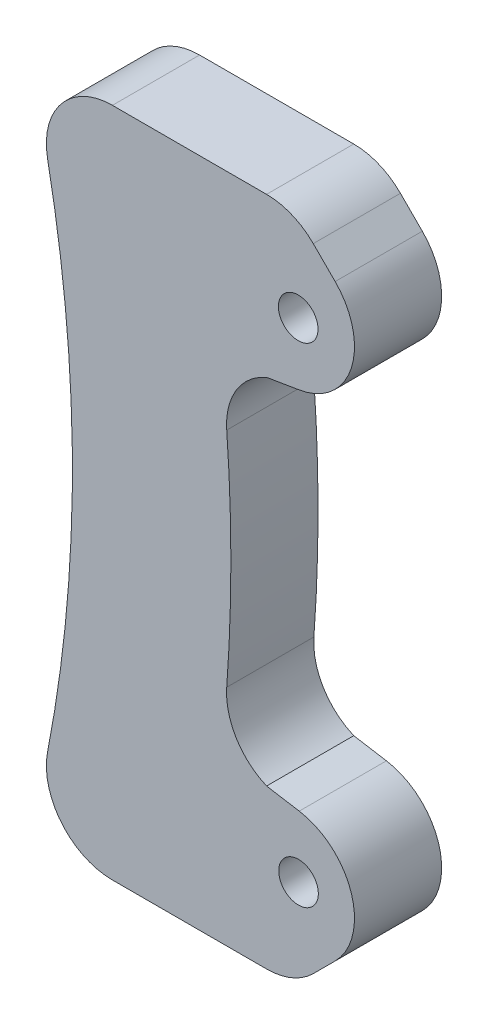
ISO-10303-21;
HEADER;
FILE_DESCRIPTION(('STEP AP214'),'2;1');
FILE_NAME('part.step','',(''),(''),'','','');
FILE_SCHEMA(('AUTOMOTIVE_DESIGN { 1 0 10303 214 1 1 1 1 }'));
ENDSEC;
DATA;
#1=APPLICATION_CONTEXT('core data for automotive mechanical design processes');
#2=APPLICATION_PROTOCOL_DEFINITION('international standard','automotive_design',2000,#1);
#3=PRODUCT_CONTEXT('',#1,'mechanical');
#4=PRODUCT('Part','Part','',(#3));
#5=PRODUCT_RELATED_PRODUCT_CATEGORY('part','',(#4));
#6=PRODUCT_DEFINITION_FORMATION('','',#4);
#7=PRODUCT_DEFINITION_CONTEXT('part definition',#1,'design');
#8=PRODUCT_DEFINITION('design','',#6,#7);
#9=PRODUCT_DEFINITION_SHAPE('','',#8);
#10=(LENGTH_UNIT() NAMED_UNIT(*) SI_UNIT(.MILLI.,.METRE.));
#11=(NAMED_UNIT(*) PLANE_ANGLE_UNIT() SI_UNIT($,.RADIAN.));
#12=(NAMED_UNIT(*) SI_UNIT($,.STERADIAN.) SOLID_ANGLE_UNIT());
#13=UNCERTAINTY_MEASURE_WITH_UNIT(LENGTH_MEASURE(1.E-05),#10,'distance_accuracy_value','');
#14=(GEOMETRIC_REPRESENTATION_CONTEXT(3) GLOBAL_UNCERTAINTY_ASSIGNED_CONTEXT((#13)) GLOBAL_UNIT_ASSIGNED_CONTEXT((#10,
#11,#12)) REPRESENTATION_CONTEXT('',''));
#15=CARTESIAN_POINT('',(0.,0.,0.));
#16=DIRECTION('',(0.,0.,1.));
#17=DIRECTION('',(1.,0.,0.));
#18=AXIS2_PLACEMENT_3D('',#15,#16,#17);
#19=CARTESIAN_POINT('',(-0.101035194584402,8.80446178487082,6.6));
#20=DIRECTION('',(0.,0.,1.));
#21=DIRECTION('',(1.,0.,0.));
#22=AXIS2_PLACEMENT_3D('',#19,#20,#21);
#23=PLANE('',#22);
#24=CARTESIAN_POINT('',(0.3250331716,18.5,6.6));
#25=DIRECTION('',(0.,0.,1.));
#26=DIRECTION('',(1.,0.,0.));
#27=AXIS2_PLACEMENT_3D('',#24,#25,#26);
#28=CIRCLE('',#27,1.5);
#29=CARTESIAN_POINT('',(1.8250331716,18.5,6.6));
#30=VERTEX_POINT('',#29);
#31=EDGE_CURVE('E182',#30,#30,#28,.T.);
#32=ORIENTED_EDGE('',*,*,#31,.F.);
#33=EDGE_LOOP('',(#32));
#34=FACE_BOUND('',#33,.T.);
#35=CARTESIAN_POINT('',(-0.101035194584402,8.80446178487082,6.6));
#36=DIRECTION('',(0.,0.,-1.));
#37=DIRECTION('',(1.,0.,0.));
#38=AXIS2_PLACEMENT_3D('',#35,#36,#37);
#39=CIRCLE('',#38,5.);
#40=CARTESIAN_POINT('',(-5.08723847448388,8.43327874172404,6.6));
#41=VERTEX_POINT('',#40);
#42=CARTESIAN_POINT('',(-2.0710678119,13.4,6.6));
#43=VERTEX_POINT('',#42);
#44=EDGE_CURVE('E209',#41,#43,#39,.T.);
#45=ORIENTED_EDGE('',*,*,#44,.T.);
#46=DIRECTION('',(0.986550454329536,0.163457031241201,0.));
#47=VECTOR('',#46,1.);
#48=CARTESIAN_POINT('',(-2.0710678119,13.4,6.6));
#49=LINE('',#48,#47);
#50=CARTESIAN_POINT('',(0.4034701921,13.8099948807,6.6));
#51=VERTEX_POINT('',#50);
#52=EDGE_CURVE('E117',#43,#51,#49,.T.);
#53=ORIENTED_EDGE('',*,*,#52,.T.);
#54=CARTESIAN_POINT('',(-0.413814964197921,18.7427471523324,6.6));
#55=DIRECTION('',(0.,0.,1.));
#56=DIRECTION('',(1.,0.,0.));
#57=AXIS2_PLACEMENT_3D('',#54,#55,#56);
#58=CIRCLE('',#57,5.);
#59=CARTESIAN_POINT('',(3.1217189417,22.2782810583,6.6));
#60=VERTEX_POINT('',#59);
#61=EDGE_CURVE('E248',#51,#60,#58,.T.);
#62=ORIENTED_EDGE('',*,*,#61,.T.);
#63=DIRECTION('',(-0.707106781186547,0.707106781186548,0.));
#64=VECTOR('',#63,1.);
#65=CARTESIAN_POINT('',(3.1217189417,22.2782810583,6.6));
#66=LINE('',#65,#64);
#67=CARTESIAN_POINT('',(1.4644660941,23.9355339059,6.6));
#68=VERTEX_POINT('',#67);
#69=EDGE_CURVE('E267',#60,#68,#66,.T.);
#70=ORIENTED_EDGE('',*,*,#69,.T.);
#71=CARTESIAN_POINT('',(-2.07106781186548,20.4,6.6));
#72=DIRECTION('',(0.,0.,1.));
#73=DIRECTION('',(1.,0.,0.));
#74=AXIS2_PLACEMENT_3D('',#71,#72,#73);
#75=CIRCLE('',#74,5.00000000000001);
#76=CARTESIAN_POINT('',(-2.0710678119,25.4,6.6));
#77=VERTEX_POINT('',#76);
#78=EDGE_CURVE('E264',#68,#77,#75,.T.);
#79=ORIENTED_EDGE('',*,*,#78,.T.);
#80=DIRECTION('',(-1.,0.,0.));
#81=VECTOR('',#80,1.);
#82=CARTESIAN_POINT('',(-2.0710678119,25.4,6.6));
#83=LINE('',#82,#81);
#84=CARTESIAN_POINT('',(-13.7439533295,25.4,6.6));
#85=VERTEX_POINT('',#84);
#86=EDGE_CURVE('E266',#77,#85,#83,.T.);
#87=ORIENTED_EDGE('',*,*,#86,.T.);
#88=CARTESIAN_POINT('',(-13.7439533295,20.4,6.6));
#89=DIRECTION('',(0.,0.,1.));
#90=DIRECTION('',(1.,0.,0.));
#91=AXIS2_PLACEMENT_3D('',#88,#89,#90);
#92=CIRCLE('',#91,5.);
#93=CARTESIAN_POINT('',(-18.6515435576519,19.4431519699825,6.6));
#94=VERTEX_POINT('',#93);
#95=EDGE_CURVE('E269',#85,#94,#92,.T.);
#96=ORIENTED_EDGE('',*,*,#95,.T.);
#97=CARTESIAN_POINT('',(-118.373776993707,9.16791800709747E-11,6.6));
#98=DIRECTION('',(0.,0.,-1.));
#99=DIRECTION('',(1.,0.,0.));
#100=AXIS2_PLACEMENT_3D('',#97,#98,#99);
#101=CIRCLE('',#100,101.600000000012);
#102=CARTESIAN_POINT('',(-18.651543557666,-19.4431519699523,6.6));
#103=VERTEX_POINT('',#102);
#104=EDGE_CURVE('E275',#94,#103,#101,.T.);
#105=ORIENTED_EDGE('',*,*,#104,.T.);
#106=CARTESIAN_POINT('',(-13.7439533295044,-20.4,6.6));
#107=DIRECTION('',(0.,0.,1.));
#108=DIRECTION('',(1.,0.,0.));
#109=AXIS2_PLACEMENT_3D('',#106,#107,#108);
#110=CIRCLE('',#109,5.);
#111=CARTESIAN_POINT('',(-13.7439533295,-25.4,6.6));
#112=VERTEX_POINT('',#111);
#113=EDGE_CURVE('E277',#103,#112,#110,.T.);
#114=ORIENTED_EDGE('',*,*,#113,.T.);
#115=DIRECTION('',(1.,0.,0.));
#116=VECTOR('',#115,1.);
#117=CARTESIAN_POINT('',(-13.7439533295,-25.4,6.6));
#118=LINE('',#117,#116);
#119=CARTESIAN_POINT('',(-2.0710678119,-25.4,6.6));
#120=VERTEX_POINT('',#119);
#121=EDGE_CURVE('E279',#112,#120,#118,.T.);
#122=ORIENTED_EDGE('',*,*,#121,.T.);
#123=CARTESIAN_POINT('',(-2.07106781186546,-20.4,6.6));
#124=DIRECTION('',(0.,0.,1.));
#125=DIRECTION('',(1.,0.,0.));
#126=AXIS2_PLACEMENT_3D('',#123,#124,#125);
#127=CIRCLE('',#126,4.99999999999997);
#128=CARTESIAN_POINT('',(1.4644660941,-23.9355339059,6.6));
#129=VERTEX_POINT('',#128);
#130=EDGE_CURVE('E281',#120,#129,#127,.T.);
#131=ORIENTED_EDGE('',*,*,#130,.T.);
#132=DIRECTION('',(0.707106781186547,0.707106781186548,0.));
#133=VECTOR('',#132,1.);
#134=CARTESIAN_POINT('',(1.4644660941,-23.9355339059,6.6));
#135=LINE('',#134,#133);
#136=CARTESIAN_POINT('',(3.1217189417,-22.2782810583,6.6));
#137=VERTEX_POINT('',#136);
#138=EDGE_CURVE('E283',#129,#137,#135,.T.);
#139=ORIENTED_EDGE('',*,*,#138,.T.);
#140=CARTESIAN_POINT('',(-0.413814964197924,-18.7427471523324,6.6));
#141=DIRECTION('',(0.,0.,1.));
#142=DIRECTION('',(1.,0.,0.));
#143=AXIS2_PLACEMENT_3D('',#140,#141,#142);
#144=CIRCLE('',#143,5.);
#145=CARTESIAN_POINT('',(0.403470192100001,-13.8099948807,6.6));
#146=VERTEX_POINT('',#145);
#147=EDGE_CURVE('E160',#137,#146,#144,.T.);
#148=ORIENTED_EDGE('',*,*,#147,.T.);
#149=DIRECTION('',(-0.986550454329536,0.163457031241201,0.));
#150=VECTOR('',#149,1.);
#151=CARTESIAN_POINT('',(0.4034701921,-13.8099948807,6.6));
#152=LINE('',#151,#150);
#153=CARTESIAN_POINT('',(-2.0710678119,-13.4,6.6));
#154=VERTEX_POINT('',#153);
#155=EDGE_CURVE('E154',#146,#154,#152,.T.);
#156=ORIENTED_EDGE('',*,*,#155,.T.);
#157=CARTESIAN_POINT('',(-0.101035194597395,-8.80446178486501,6.6));
#158=DIRECTION('',(0.,0.,-1.));
#159=DIRECTION('',(1.,0.,0.));
#160=AXIS2_PLACEMENT_3D('',#157,#158,#159);
#161=CIRCLE('',#160,5.00000000000022);
#162=CARTESIAN_POINT('',(-5.08723847449502,-8.43327874169032,6.6));
#163=VERTEX_POINT('',#162);
#164=EDGE_CURVE('E158',#154,#163,#161,.T.);
#165=ORIENTED_EDGE('',*,*,#164,.T.);
#166=CARTESIAN_POINT('',(-118.373776993707,9.16791800709747E-11,6.6));
#167=DIRECTION('',(0.,0.,1.));
#168=DIRECTION('',(1.,0.,0.));
#169=AXIS2_PLACEMENT_3D('',#166,#167,#168);
#170=CIRCLE('',#169,113.600000000006);
#171=EDGE_CURVE('E50',#163,#41,#170,.T.);
#172=ORIENTED_EDGE('',*,*,#171,.T.);
#173=EDGE_LOOP('',(#45,#53,#62,#70,#79,#87,#96,#105,#114,#122,#131,#139,#148,#156,#165,#172));
#174=FACE_BOUND('',#173,.T.);
#175=CARTESIAN_POINT('',(0.3484564424,-18.5,6.6));
#176=DIRECTION('',(0.,0.,1.));
#177=DIRECTION('',(1.,0.,0.));
#178=AXIS2_PLACEMENT_3D('',#175,#176,#177);
#179=CIRCLE('',#178,1.50000000000001);
#180=CARTESIAN_POINT('',(1.84845644240001,-18.5,6.6));
#181=VERTEX_POINT('',#180);
#182=EDGE_CURVE('E326',#181,#181,#179,.T.);
#183=ORIENTED_EDGE('',*,*,#182,.F.);
#184=EDGE_LOOP('',(#183));
#185=FACE_BOUND('',#184,.T.);
#186=ADVANCED_FACE('F33',(#34,#174,#185),#23,.T.);
#187=CARTESIAN_POINT('',(-0.101035194584402,8.80446178487082,0.));
#188=DIRECTION('',(0.,0.,1.));
#189=DIRECTION('',(1.,0.,0.));
#190=AXIS2_PLACEMENT_3D('',#187,#188,#189);
#191=PLANE('',#190);
#192=CARTESIAN_POINT('',(0.3250331716,18.5,0.));
#193=DIRECTION('',(0.,0.,1.));
#194=DIRECTION('',(1.,0.,0.));
#195=AXIS2_PLACEMENT_3D('',#192,#193,#194);
#196=CIRCLE('',#195,1.5);
#197=CARTESIAN_POINT('',(1.8250331716,18.5,0.));
#198=VERTEX_POINT('',#197);
#199=EDGE_CURVE('E331',#198,#198,#196,.T.);
#200=ORIENTED_EDGE('',*,*,#199,.T.);
#201=EDGE_LOOP('',(#200));
#202=FACE_BOUND('',#201,.T.);
#203=CARTESIAN_POINT('',(-0.101035194584402,8.80446178487082,0.));
#204=DIRECTION('',(0.,0.,-1.));
#205=DIRECTION('',(1.,0.,0.));
#206=AXIS2_PLACEMENT_3D('',#203,#204,#205);
#207=CIRCLE('',#206,5.);
#208=CARTESIAN_POINT('',(-5.08723847448388,8.43327874172404,0.));
#209=VERTEX_POINT('',#208);
#210=CARTESIAN_POINT('',(-2.0710678119,13.4,0.));
#211=VERTEX_POINT('',#210);
#212=EDGE_CURVE('E178',#209,#211,#207,.T.);
#213=ORIENTED_EDGE('',*,*,#212,.F.);
#214=CARTESIAN_POINT('',(-118.373776993707,9.16791800709747E-11,0.));
#215=DIRECTION('',(0.,0.,1.));
#216=DIRECTION('',(1.,0.,0.));
#217=AXIS2_PLACEMENT_3D('',#214,#215,#216);
#218=CIRCLE('',#217,113.600000000006);
#219=CARTESIAN_POINT('',(-5.08723847449502,-8.43327874169032,0.));
#220=VERTEX_POINT('',#219);
#221=EDGE_CURVE('E109',#220,#209,#218,.T.);
#222=ORIENTED_EDGE('',*,*,#221,.F.);
#223=CARTESIAN_POINT('',(-0.101035194597395,-8.80446178486501,0.));
#224=DIRECTION('',(0.,0.,-1.));
#225=DIRECTION('',(1.,0.,0.));
#226=AXIS2_PLACEMENT_3D('',#223,#224,#225);
#227=CIRCLE('',#226,5.00000000000022);
#228=CARTESIAN_POINT('',(-2.0710678119,-13.4,0.));
#229=VERTEX_POINT('',#228);
#230=EDGE_CURVE('E103',#229,#220,#227,.T.);
#231=ORIENTED_EDGE('',*,*,#230,.F.);
#232=DIRECTION('',(-0.986550454329536,0.163457031241201,0.));
#233=VECTOR('',#232,1.);
#234=CARTESIAN_POINT('',(0.4034701921,-13.8099948807,0.));
#235=LINE('',#234,#233);
#236=CARTESIAN_POINT('',(0.403470192100001,-13.8099948807,0.));
#237=VERTEX_POINT('',#236);
#238=EDGE_CURVE('E168',#237,#229,#235,.T.);
#239=ORIENTED_EDGE('',*,*,#238,.F.);
#240=CARTESIAN_POINT('',(-0.413814964197924,-18.7427471523324,0.));
#241=DIRECTION('',(0.,0.,1.));
#242=DIRECTION('',(1.,0.,0.));
#243=AXIS2_PLACEMENT_3D('',#240,#241,#242);
#244=CIRCLE('',#243,5.);
#245=CARTESIAN_POINT('',(3.1217189417,-22.2782810583,0.));
#246=VERTEX_POINT('',#245);
#247=EDGE_CURVE('E204',#246,#237,#244,.T.);
#248=ORIENTED_EDGE('',*,*,#247,.F.);
#249=DIRECTION('',(0.707106781186547,0.707106781186548,0.));
#250=VECTOR('',#249,1.);
#251=CARTESIAN_POINT('',(1.4644660941,-23.9355339059,0.));
#252=LINE('',#251,#250);
#253=CARTESIAN_POINT('',(1.4644660941,-23.9355339059,0.));
#254=VERTEX_POINT('',#253);
#255=EDGE_CURVE('E202',#254,#246,#252,.T.);
#256=ORIENTED_EDGE('',*,*,#255,.F.);
#257=CARTESIAN_POINT('',(-2.07106781186546,-20.4,0.));
#258=DIRECTION('',(0.,0.,1.));
#259=DIRECTION('',(1.,0.,0.));
#260=AXIS2_PLACEMENT_3D('',#257,#258,#259);
#261=CIRCLE('',#260,4.99999999999997);
#262=CARTESIAN_POINT('',(-2.0710678119,-25.4,0.));
#263=VERTEX_POINT('',#262);
#264=EDGE_CURVE('E200',#263,#254,#261,.T.);
#265=ORIENTED_EDGE('',*,*,#264,.F.);
#266=DIRECTION('',(1.,0.,0.));
#267=VECTOR('',#266,1.);
#268=CARTESIAN_POINT('',(-13.7439533295,-25.4,0.));
#269=LINE('',#268,#267);
#270=CARTESIAN_POINT('',(-13.7439533295,-25.4,0.));
#271=VERTEX_POINT('',#270);
#272=EDGE_CURVE('E198',#271,#263,#269,.T.);
#273=ORIENTED_EDGE('',*,*,#272,.F.);
#274=CARTESIAN_POINT('',(-13.7439533295044,-20.4,0.));
#275=DIRECTION('',(0.,0.,1.));
#276=DIRECTION('',(1.,0.,0.));
#277=AXIS2_PLACEMENT_3D('',#274,#275,#276);
#278=CIRCLE('',#277,5.);
#279=CARTESIAN_POINT('',(-18.651543557666,-19.4431519699523,0.));
#280=VERTEX_POINT('',#279);
#281=EDGE_CURVE('E196',#280,#271,#278,.T.);
#282=ORIENTED_EDGE('',*,*,#281,.F.);
#283=CARTESIAN_POINT('',(-118.373776993707,9.16791800709747E-11,0.));
#284=DIRECTION('',(0.,0.,-1.));
#285=DIRECTION('',(1.,0.,0.));
#286=AXIS2_PLACEMENT_3D('',#283,#284,#285);
#287=CIRCLE('',#286,101.600000000012);
#288=CARTESIAN_POINT('',(-18.6515435576519,19.4431519699825,0.));
#289=VERTEX_POINT('',#288);
#290=EDGE_CURVE('E194',#289,#280,#287,.T.);
#291=ORIENTED_EDGE('',*,*,#290,.F.);
#292=CARTESIAN_POINT('',(-13.7439533295,20.4,0.));
#293=DIRECTION('',(0.,0.,1.));
#294=DIRECTION('',(1.,0.,0.));
#295=AXIS2_PLACEMENT_3D('',#292,#293,#294);
#296=CIRCLE('',#295,5.);
#297=CARTESIAN_POINT('',(-13.7439533295,25.4,0.));
#298=VERTEX_POINT('',#297);
#299=EDGE_CURVE('E192',#298,#289,#296,.T.);
#300=ORIENTED_EDGE('',*,*,#299,.F.);
#301=DIRECTION('',(-1.,0.,0.));
#302=VECTOR('',#301,1.);
#303=CARTESIAN_POINT('',(-2.0710678119,25.4,0.));
#304=LINE('',#303,#302);
#305=CARTESIAN_POINT('',(-2.0710678119,25.4,0.));
#306=VERTEX_POINT('',#305);
#307=EDGE_CURVE('E190',#306,#298,#304,.T.);
#308=ORIENTED_EDGE('',*,*,#307,.F.);
#309=CARTESIAN_POINT('',(-2.07106781186548,20.4,0.));
#310=DIRECTION('',(0.,0.,1.));
#311=DIRECTION('',(1.,0.,0.));
#312=AXIS2_PLACEMENT_3D('',#309,#310,#311);
#313=CIRCLE('',#312,5.00000000000001);
#314=CARTESIAN_POINT('',(1.4644660941,23.9355339059,0.));
#315=VERTEX_POINT('',#314);
#316=EDGE_CURVE('E188',#315,#306,#313,.T.);
#317=ORIENTED_EDGE('',*,*,#316,.F.);
#318=DIRECTION('',(-0.707106781186547,0.707106781186548,0.));
#319=VECTOR('',#318,1.);
#320=CARTESIAN_POINT('',(3.1217189417,22.2782810583,0.));
#321=LINE('',#320,#319);
#322=CARTESIAN_POINT('',(3.1217189417,22.2782810583,0.));
#323=VERTEX_POINT('',#322);
#324=EDGE_CURVE('E186',#323,#315,#321,.T.);
#325=ORIENTED_EDGE('',*,*,#324,.F.);
#326=CARTESIAN_POINT('',(-0.413814964197921,18.7427471523324,0.));
#327=DIRECTION('',(0.,0.,1.));
#328=DIRECTION('',(1.,0.,0.));
#329=AXIS2_PLACEMENT_3D('',#326,#327,#328);
#330=CIRCLE('',#329,5.);
#331=CARTESIAN_POINT('',(0.4034701921,13.8099948807,0.));
#332=VERTEX_POINT('',#331);
#333=EDGE_CURVE('E184',#332,#323,#330,.T.);
#334=ORIENTED_EDGE('',*,*,#333,.F.);
#335=DIRECTION('',(0.986550454329536,0.163457031241201,0.));
#336=VECTOR('',#335,1.);
#337=CARTESIAN_POINT('',(-2.0710678119,13.4,0.));
#338=LINE('',#337,#336);
#339=EDGE_CURVE('E181',#211,#332,#338,.T.);
#340=ORIENTED_EDGE('',*,*,#339,.F.);
#341=EDGE_LOOP('',(#213,#222,#231,#239,#248,#256,#265,#273,#282,#291,#300,#308,#317,#325,#334,#340));
#342=FACE_BOUND('',#341,.T.);
#343=CARTESIAN_POINT('',(0.3484564424,-18.5,0.));
#344=DIRECTION('',(0.,0.,1.));
#345=DIRECTION('',(1.,0.,0.));
#346=AXIS2_PLACEMENT_3D('',#343,#344,#345);
#347=CIRCLE('',#346,1.50000000000001);
#348=CARTESIAN_POINT('',(1.84845644240001,-18.5,0.));
#349=VERTEX_POINT('',#348);
#350=EDGE_CURVE('E329',#349,#349,#347,.T.);
#351=ORIENTED_EDGE('',*,*,#350,.T.);
#352=EDGE_LOOP('',(#351));
#353=FACE_BOUND('',#352,.T.);
#354=ADVANCED_FACE('F252',(#202,#342,#353),#191,.F.);
#355=CARTESIAN_POINT('',(-0.101035194584402,8.80446178487082,6.6));
#356=DIRECTION('',(0.,0.,-1.));
#357=DIRECTION('',(-1.,0.,0.));
#358=AXIS2_PLACEMENT_3D('',#355,#356,#357);
#359=CYLINDRICAL_SURFACE('',#358,5.);
#360=ORIENTED_EDGE('',*,*,#212,.T.);
#361=DIRECTION('',(0.,0.,-1.));
#362=VECTOR('',#361,1.);
#363=CARTESIAN_POINT('',(-2.0710678119,13.4,6.6));
#364=LINE('',#363,#362);
#365=EDGE_CURVE('E11',#43,#211,#364,.T.);
#366=ORIENTED_EDGE('',*,*,#365,.F.);
#367=ORIENTED_EDGE('',*,*,#44,.F.);
#368=DIRECTION('',(0.,0.,-1.));
#369=VECTOR('',#368,1.);
#370=CARTESIAN_POINT('',(-5.08723847448388,8.43327874172404,6.6));
#371=LINE('',#370,#369);
#372=EDGE_CURVE('E174',#41,#209,#371,.T.);
#373=ORIENTED_EDGE('',*,*,#372,.T.);
#374=EDGE_LOOP('',(#360,#366,#367,#373));
#375=FACE_BOUND('',#374,.T.);
#376=ADVANCED_FACE('F35',(#375),#359,.F.);
#377=CARTESIAN_POINT('',(-2.0710678119,13.4,6.6));
#378=DIRECTION('',(-0.163457031241201,0.986550454329535,0.));
#379=DIRECTION('',(-0.986550454329536,-0.163457031241201,0.));
#380=AXIS2_PLACEMENT_3D('',#377,#378,#379);
#381=PLANE('',#380);
#382=ORIENTED_EDGE('',*,*,#339,.T.);
#383=DIRECTION('',(0.,0.,-1.));
#384=VECTOR('',#383,1.);
#385=CARTESIAN_POINT('',(0.4034701921,13.8099948807,6.6));
#386=LINE('',#385,#384);
#387=EDGE_CURVE('E42',#51,#332,#386,.T.);
#388=ORIENTED_EDGE('',*,*,#387,.F.);
#389=ORIENTED_EDGE('',*,*,#52,.F.);
#390=ORIENTED_EDGE('',*,*,#365,.T.);
#391=EDGE_LOOP('',(#382,#388,#389,#390));
#392=FACE_BOUND('',#391,.T.);
#393=ADVANCED_FACE('F464',(#392),#381,.F.);
#394=CARTESIAN_POINT('',(-0.413814964197921,18.7427471523324,6.6));
#395=DIRECTION('',(0.,0.,-1.));
#396=DIRECTION('',(-1.,0.,0.));
#397=AXIS2_PLACEMENT_3D('',#394,#395,#396);
#398=CYLINDRICAL_SURFACE('',#397,5.);
#399=ORIENTED_EDGE('',*,*,#333,.T.);
#400=DIRECTION('',(0.,0.,-1.));
#401=VECTOR('',#400,1.);
#402=CARTESIAN_POINT('',(3.1217189417,22.2782810583,6.6));
#403=LINE('',#402,#401);
#404=EDGE_CURVE('E240',#60,#323,#403,.T.);
#405=ORIENTED_EDGE('',*,*,#404,.F.);
#406=ORIENTED_EDGE('',*,*,#61,.F.);
#407=ORIENTED_EDGE('',*,*,#387,.T.);
#408=EDGE_LOOP('',(#399,#405,#406,#407));
#409=FACE_BOUND('',#408,.T.);
#410=ADVANCED_FACE('F246',(#409),#398,.T.);
#411=CARTESIAN_POINT('',(3.1217189417,22.2782810583,6.6));
#412=DIRECTION('',(-0.707106781186548,-0.707106781186547,0.));
#413=DIRECTION('',(0.707106781186547,-0.707106781186548,0.));
#414=AXIS2_PLACEMENT_3D('',#411,#412,#413);
#415=PLANE('',#414);
#416=ORIENTED_EDGE('',*,*,#324,.T.);
#417=DIRECTION('',(0.,0.,-1.));
#418=VECTOR('',#417,1.);
#419=CARTESIAN_POINT('',(1.4644660941,23.9355339059,6.6));
#420=LINE('',#419,#418);
#421=EDGE_CURVE('E237',#68,#315,#420,.T.);
#422=ORIENTED_EDGE('',*,*,#421,.F.);
#423=ORIENTED_EDGE('',*,*,#69,.F.);
#424=ORIENTED_EDGE('',*,*,#404,.T.);
#425=EDGE_LOOP('',(#416,#422,#423,#424));
#426=FACE_BOUND('',#425,.T.);
#427=ADVANCED_FACE('F258',(#426),#415,.F.);
#428=CARTESIAN_POINT('',(-2.07106781186548,20.4,6.6));
#429=DIRECTION('',(0.,0.,-1.));
#430=DIRECTION('',(-1.,0.,0.));
#431=AXIS2_PLACEMENT_3D('',#428,#429,#430);
#432=CYLINDRICAL_SURFACE('',#431,5.00000000000001);
#433=ORIENTED_EDGE('',*,*,#316,.T.);
#434=DIRECTION('',(0.,0.,-1.));
#435=VECTOR('',#434,1.);
#436=CARTESIAN_POINT('',(-2.0710678119,25.4,6.6));
#437=LINE('',#436,#435);
#438=EDGE_CURVE('E234',#77,#306,#437,.T.);
#439=ORIENTED_EDGE('',*,*,#438,.F.);
#440=ORIENTED_EDGE('',*,*,#78,.F.);
#441=ORIENTED_EDGE('',*,*,#421,.T.);
#442=EDGE_LOOP('',(#433,#439,#440,#441));
#443=FACE_BOUND('',#442,.T.);
#444=ADVANCED_FACE('F262',(#443),#432,.T.);
#445=CARTESIAN_POINT('',(-2.0710678119,25.4,6.6));
#446=DIRECTION('',(0.,-1.,0.));
#447=DIRECTION('',(0.,0.,-1.));
#448=AXIS2_PLACEMENT_3D('',#445,#446,#447);
#449=PLANE('',#448);
#450=ORIENTED_EDGE('',*,*,#307,.T.);
#451=DIRECTION('',(0.,0.,-1.));
#452=VECTOR('',#451,1.);
#453=CARTESIAN_POINT('',(-13.7439533295,25.4,6.6));
#454=LINE('',#453,#452);
#455=EDGE_CURVE('E231',#85,#298,#454,.T.);
#456=ORIENTED_EDGE('',*,*,#455,.F.);
#457=ORIENTED_EDGE('',*,*,#86,.F.);
#458=ORIENTED_EDGE('',*,*,#438,.T.);
#459=EDGE_LOOP('',(#450,#456,#457,#458));
#460=FACE_BOUND('',#459,.T.);
#461=ADVANCED_FACE('F429',(#460),#449,.F.);
#462=CARTESIAN_POINT('',(-13.7439533295,20.4,6.6));
#463=DIRECTION('',(0.,0.,-1.));
#464=DIRECTION('',(-1.,0.,0.));
#465=AXIS2_PLACEMENT_3D('',#462,#463,#464);
#466=CYLINDRICAL_SURFACE('',#465,5.);
#467=ORIENTED_EDGE('',*,*,#299,.T.);
#468=DIRECTION('',(0.,0.,-1.));
#469=VECTOR('',#468,1.);
#470=CARTESIAN_POINT('',(-18.6515435576519,19.4431519699825,6.6));
#471=LINE('',#470,#469);
#472=EDGE_CURVE('E228',#94,#289,#471,.T.);
#473=ORIENTED_EDGE('',*,*,#472,.F.);
#474=ORIENTED_EDGE('',*,*,#95,.F.);
#475=ORIENTED_EDGE('',*,*,#455,.T.);
#476=EDGE_LOOP('',(#467,#473,#474,#475));
#477=FACE_BOUND('',#476,.T.);
#478=ADVANCED_FACE('F419',(#477),#466,.T.);
#479=CARTESIAN_POINT('',(-118.373776993707,9.16791800709747E-11,6.6));
#480=DIRECTION('',(0.,0.,-1.));
#481=DIRECTION('',(-1.,0.,0.));
#482=AXIS2_PLACEMENT_3D('',#479,#480,#481);
#483=CYLINDRICAL_SURFACE('',#482,101.600000000012);
#484=ORIENTED_EDGE('',*,*,#290,.T.);
#485=DIRECTION('',(0.,0.,-1.));
#486=VECTOR('',#485,1.);
#487=CARTESIAN_POINT('',(-18.651543557666,-19.4431519699523,6.6));
#488=LINE('',#487,#486);
#489=EDGE_CURVE('E225',#103,#280,#488,.T.);
#490=ORIENTED_EDGE('',*,*,#489,.F.);
#491=ORIENTED_EDGE('',*,*,#104,.F.);
#492=ORIENTED_EDGE('',*,*,#472,.T.);
#493=EDGE_LOOP('',(#484,#490,#491,#492));
#494=FACE_BOUND('',#493,.T.);
#495=ADVANCED_FACE('F409',(#494),#483,.F.);
#496=CARTESIAN_POINT('',(-13.7439533295044,-20.4,6.6));
#497=DIRECTION('',(0.,0.,-1.));
#498=DIRECTION('',(-1.,0.,0.));
#499=AXIS2_PLACEMENT_3D('',#496,#497,#498);
#500=CYLINDRICAL_SURFACE('',#499,5.);
#501=ORIENTED_EDGE('',*,*,#281,.T.);
#502=DIRECTION('',(0.,0.,-1.));
#503=VECTOR('',#502,1.);
#504=CARTESIAN_POINT('',(-13.7439533295,-25.4,6.6));
#505=LINE('',#504,#503);
#506=EDGE_CURVE('E222',#112,#271,#505,.T.);
#507=ORIENTED_EDGE('',*,*,#506,.F.);
#508=ORIENTED_EDGE('',*,*,#113,.F.);
#509=ORIENTED_EDGE('',*,*,#489,.T.);
#510=EDGE_LOOP('',(#501,#507,#508,#509));
#511=FACE_BOUND('',#510,.T.);
#512=ADVANCED_FACE('F399',(#511),#500,.T.);
#513=CARTESIAN_POINT('',(-13.7439533295,-25.4,6.6));
#514=DIRECTION('',(0.,1.,0.));
#515=DIRECTION('',(0.,0.,1.));
#516=AXIS2_PLACEMENT_3D('',#513,#514,#515);
#517=PLANE('',#516);
#518=ORIENTED_EDGE('',*,*,#272,.T.);
#519=DIRECTION('',(0.,0.,-1.));
#520=VECTOR('',#519,1.);
#521=CARTESIAN_POINT('',(-2.0710678119,-25.4,6.6));
#522=LINE('',#521,#520);
#523=EDGE_CURVE('E219',#120,#263,#522,.T.);
#524=ORIENTED_EDGE('',*,*,#523,.F.);
#525=ORIENTED_EDGE('',*,*,#121,.F.);
#526=ORIENTED_EDGE('',*,*,#506,.T.);
#527=EDGE_LOOP('',(#518,#524,#525,#526));
#528=FACE_BOUND('',#527,.T.);
#529=ADVANCED_FACE('F389',(#528),#517,.F.);
#530=CARTESIAN_POINT('',(-2.07106781186546,-20.4,6.6));
#531=DIRECTION('',(0.,0.,-1.));
#532=DIRECTION('',(-1.,0.,0.));
#533=AXIS2_PLACEMENT_3D('',#530,#531,#532);
#534=CYLINDRICAL_SURFACE('',#533,4.99999999999997);
#535=ORIENTED_EDGE('',*,*,#264,.T.);
#536=DIRECTION('',(0.,0.,-1.));
#537=VECTOR('',#536,1.);
#538=CARTESIAN_POINT('',(1.4644660941,-23.9355339059,6.6));
#539=LINE('',#538,#537);
#540=EDGE_CURVE('E216',#129,#254,#539,.T.);
#541=ORIENTED_EDGE('',*,*,#540,.F.);
#542=ORIENTED_EDGE('',*,*,#130,.F.);
#543=ORIENTED_EDGE('',*,*,#523,.T.);
#544=EDGE_LOOP('',(#535,#541,#542,#543));
#545=FACE_BOUND('',#544,.T.);
#546=ADVANCED_FACE('F380',(#545),#534,.T.);
#547=CARTESIAN_POINT('',(1.4644660941,-23.9355339059,6.6));
#548=DIRECTION('',(-0.707106781186548,0.707106781186547,0.));
#549=DIRECTION('',(-0.707106781186547,-0.707106781186548,0.));
#550=AXIS2_PLACEMENT_3D('',#547,#548,#549);
#551=PLANE('',#550);
#552=ORIENTED_EDGE('',*,*,#255,.T.);
#553=DIRECTION('',(0.,0.,-1.));
#554=VECTOR('',#553,1.);
#555=CARTESIAN_POINT('',(3.1217189417,-22.2782810583,6.6));
#556=LINE('',#555,#554);
#557=EDGE_CURVE('E213',#137,#246,#556,.T.);
#558=ORIENTED_EDGE('',*,*,#557,.F.);
#559=ORIENTED_EDGE('',*,*,#138,.F.);
#560=ORIENTED_EDGE('',*,*,#540,.T.);
#561=EDGE_LOOP('',(#552,#558,#559,#560));
#562=FACE_BOUND('',#561,.T.);
#563=ADVANCED_FACE('F289',(#562),#551,.F.);
#564=CARTESIAN_POINT('',(-0.413814964197924,-18.7427471523324,6.6));
#565=DIRECTION('',(0.,0.,-1.));
#566=DIRECTION('',(-1.,0.,0.));
#567=AXIS2_PLACEMENT_3D('',#564,#565,#566);
#568=CYLINDRICAL_SURFACE('',#567,5.);
#569=ORIENTED_EDGE('',*,*,#247,.T.);
#570=DIRECTION('',(0.,0.,-1.));
#571=VECTOR('',#570,1.);
#572=CARTESIAN_POINT('',(0.403470192100001,-13.8099948807,6.6));
#573=LINE('',#572,#571);
#574=EDGE_CURVE('E169',#146,#237,#573,.T.);
#575=ORIENTED_EDGE('',*,*,#574,.F.);
#576=ORIENTED_EDGE('',*,*,#147,.F.);
#577=ORIENTED_EDGE('',*,*,#557,.T.);
#578=EDGE_LOOP('',(#569,#575,#576,#577));
#579=FACE_BOUND('',#578,.T.);
#580=ADVANCED_FACE('F293',(#579),#568,.T.);
#581=CARTESIAN_POINT('',(0.4034701921,-13.8099948807,6.6));
#582=DIRECTION('',(-0.163457031241201,-0.986550454329535,0.));
#583=DIRECTION('',(0.986550454329536,-0.163457031241201,0.));
#584=AXIS2_PLACEMENT_3D('',#581,#582,#583);
#585=PLANE('',#584);
#586=ORIENTED_EDGE('',*,*,#238,.T.);
#587=DIRECTION('',(0.,0.,-1.));
#588=VECTOR('',#587,1.);
#589=CARTESIAN_POINT('',(-2.0710678119,-13.4,6.6));
#590=LINE('',#589,#588);
#591=EDGE_CURVE('E165',#154,#229,#590,.T.);
#592=ORIENTED_EDGE('',*,*,#591,.F.);
#593=ORIENTED_EDGE('',*,*,#155,.F.);
#594=ORIENTED_EDGE('',*,*,#574,.T.);
#595=EDGE_LOOP('',(#586,#592,#593,#594));
#596=FACE_BOUND('',#595,.T.);
#597=ADVANCED_FACE('F166',(#596),#585,.F.);
#598=CARTESIAN_POINT('',(-0.101035194597395,-8.80446178486501,6.6));
#599=DIRECTION('',(0.,0.,-1.));
#600=DIRECTION('',(-1.,0.,0.));
#601=AXIS2_PLACEMENT_3D('',#598,#599,#600);
#602=CYLINDRICAL_SURFACE('',#601,5.00000000000022);
#603=ORIENTED_EDGE('',*,*,#230,.T.);
#604=DIRECTION('',(0.,0.,-1.));
#605=VECTOR('',#604,1.);
#606=CARTESIAN_POINT('',(-5.08723847449502,-8.43327874169032,6.6));
#607=LINE('',#606,#605);
#608=EDGE_CURVE('E170',#163,#220,#607,.T.);
#609=ORIENTED_EDGE('',*,*,#608,.F.);
#610=ORIENTED_EDGE('',*,*,#164,.F.);
#611=ORIENTED_EDGE('',*,*,#591,.T.);
#612=EDGE_LOOP('',(#603,#609,#610,#611));
#613=FACE_BOUND('',#612,.T.);
#614=ADVANCED_FACE('F172',(#613),#602,.F.);
#615=CARTESIAN_POINT('',(-118.373776993707,9.16791800709747E-11,6.6));
#616=DIRECTION('',(0.,0.,-1.));
#617=DIRECTION('',(-1.,0.,0.));
#618=AXIS2_PLACEMENT_3D('',#615,#616,#617);
#619=CYLINDRICAL_SURFACE('',#618,113.600000000006);
#620=ORIENTED_EDGE('',*,*,#221,.T.);
#621=ORIENTED_EDGE('',*,*,#372,.F.);
#622=ORIENTED_EDGE('',*,*,#171,.F.);
#623=ORIENTED_EDGE('',*,*,#608,.T.);
#624=EDGE_LOOP('',(#620,#621,#622,#623));
#625=FACE_BOUND('',#624,.T.);
#626=ADVANCED_FACE('F297',(#625),#619,.T.);
#627=CARTESIAN_POINT('',(0.3250331716,18.5,6.6));
#628=DIRECTION('',(0.,0.,-1.));
#629=DIRECTION('',(-1.,0.,0.));
#630=AXIS2_PLACEMENT_3D('',#627,#628,#629);
#631=CYLINDRICAL_SURFACE('',#630,1.5);
#632=ORIENTED_EDGE('',*,*,#31,.T.);
#633=EDGE_LOOP('',(#632));
#634=FACE_BOUND('',#633,.T.);
#635=ORIENTED_EDGE('',*,*,#199,.F.);
#636=EDGE_LOOP('',(#635));
#637=FACE_BOUND('',#636,.T.);
#638=ADVANCED_FACE('F299',(#634,#637),#631,.F.);
#639=CARTESIAN_POINT('',(0.3484564424,-18.5,6.6));
#640=DIRECTION('',(0.,0.,-1.));
#641=DIRECTION('',(-1.,0.,0.));
#642=AXIS2_PLACEMENT_3D('',#639,#640,#641);
#643=CYLINDRICAL_SURFACE('',#642,1.50000000000001);
#644=ORIENTED_EDGE('',*,*,#182,.T.);
#645=EDGE_LOOP('',(#644));
#646=FACE_BOUND('',#645,.T.);
#647=ORIENTED_EDGE('',*,*,#350,.F.);
#648=EDGE_LOOP('',(#647));
#649=FACE_BOUND('',#648,.T.);
#650=ADVANCED_FACE('F305',(#646,#649),#643,.F.);
#651=CLOSED_SHELL('',(#186,#354,#376,#393,#410,#427,#444,#461,#478,#495,#512,#529,#546,#563,
#580,#597,#614,#626,#638,#650));
#652=MANIFOLD_SOLID_BREP('B2',#651);
#653=ADVANCED_BREP_SHAPE_REPRESENTATION('',(#18,#652),#14);
#654=SHAPE_DEFINITION_REPRESENTATION(#9,#653);
ENDSEC;
END-ISO-10303-21;
